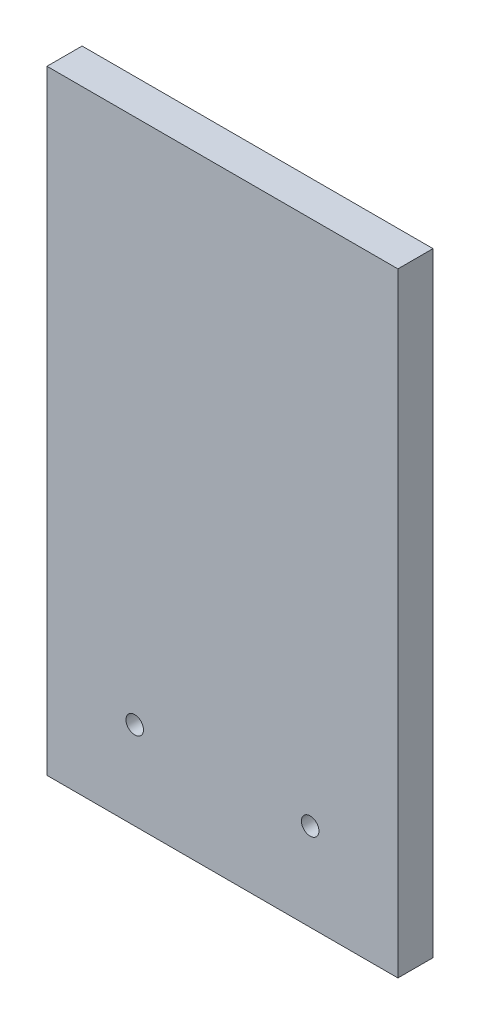
ISO-10303-21;
HEADER;
FILE_DESCRIPTION(('STEP AP214'),'2;1');
FILE_NAME('part.step','',(''),(''),'','','');
FILE_SCHEMA(('AUTOMOTIVE_DESIGN { 1 0 10303 214 1 1 1 1 }'));
ENDSEC;
DATA;
#1=APPLICATION_CONTEXT('core data for automotive mechanical design processes');
#2=APPLICATION_PROTOCOL_DEFINITION('international standard','automotive_design',2000,#1);
#3=PRODUCT_CONTEXT('',#1,'mechanical');
#4=PRODUCT('Part','Part','',(#3));
#5=PRODUCT_RELATED_PRODUCT_CATEGORY('part','',(#4));
#6=PRODUCT_DEFINITION_FORMATION('','',#4);
#7=PRODUCT_DEFINITION_CONTEXT('part definition',#1,'design');
#8=PRODUCT_DEFINITION('design','',#6,#7);
#9=PRODUCT_DEFINITION_SHAPE('','',#8);
#10=(LENGTH_UNIT() NAMED_UNIT(*) SI_UNIT(.MILLI.,.METRE.));
#11=(NAMED_UNIT(*) PLANE_ANGLE_UNIT() SI_UNIT($,.RADIAN.));
#12=(NAMED_UNIT(*) SI_UNIT($,.STERADIAN.) SOLID_ANGLE_UNIT());
#13=UNCERTAINTY_MEASURE_WITH_UNIT(LENGTH_MEASURE(1.E-05),#10,'distance_accuracy_value','');
#14=(GEOMETRIC_REPRESENTATION_CONTEXT(3) GLOBAL_UNCERTAINTY_ASSIGNED_CONTEXT((#13)) GLOBAL_UNIT_ASSIGNED_CONTEXT((#10,
#11,#12)) REPRESENTATION_CONTEXT('',''));
#15=CARTESIAN_POINT('',(0.,0.,0.));
#16=DIRECTION('',(0.,0.,1.));
#17=DIRECTION('',(1.,0.,0.));
#18=AXIS2_PLACEMENT_3D('',#15,#16,#17);
#19=CARTESIAN_POINT('',(50.,87.5,10.));
#20=DIRECTION('',(-1.,0.,0.));
#21=DIRECTION('',(0.,-1.,0.));
#22=AXIS2_PLACEMENT_3D('',#19,#20,#21);
#23=PLANE('',#22);
#24=DIRECTION('',(0.,1.,0.));
#25=VECTOR('',#24,1.);
#26=CARTESIAN_POINT('',(50.,87.5,0.));
#27=LINE('',#26,#25);
#28=CARTESIAN_POINT('',(50.,-87.5,0.));
#29=VERTEX_POINT('',#28);
#30=CARTESIAN_POINT('',(50.,87.5,0.));
#31=VERTEX_POINT('',#30);
#32=EDGE_CURVE('E111',#29,#31,#27,.T.);
#33=ORIENTED_EDGE('',*,*,#32,.T.);
#34=DIRECTION('',(0.,0.,-1.));
#35=VECTOR('',#34,1.);
#36=CARTESIAN_POINT('',(50.,87.5,10.));
#37=LINE('',#36,#35);
#38=CARTESIAN_POINT('',(50.,87.5,10.));
#39=VERTEX_POINT('',#38);
#40=EDGE_CURVE('E13',#39,#31,#37,.T.);
#41=ORIENTED_EDGE('',*,*,#40,.F.);
#42=DIRECTION('',(0.,1.,0.));
#43=VECTOR('',#42,1.);
#44=CARTESIAN_POINT('',(50.,87.5,10.));
#45=LINE('',#44,#43);
#46=CARTESIAN_POINT('',(50.,-87.5,10.));
#47=VERTEX_POINT('',#46);
#48=EDGE_CURVE('E99',#47,#39,#45,.T.);
#49=ORIENTED_EDGE('',*,*,#48,.F.);
#50=DIRECTION('',(0.,0.,-1.));
#51=VECTOR('',#50,1.);
#52=CARTESIAN_POINT('',(50.,-87.5,10.));
#53=LINE('',#52,#51);
#54=EDGE_CURVE('E107',#47,#29,#53,.T.);
#55=ORIENTED_EDGE('',*,*,#54,.T.);
#56=EDGE_LOOP('',(#33,#41,#49,#55));
#57=FACE_BOUND('',#56,.T.);
#58=ADVANCED_FACE('F48',(#57),#23,.F.);
#59=CARTESIAN_POINT('',(50.,87.5,10.));
#60=DIRECTION('',(0.,-1.,0.));
#61=DIRECTION('',(1.,0.,0.));
#62=AXIS2_PLACEMENT_3D('',#59,#60,#61);
#63=PLANE('',#62);
#64=DIRECTION('',(-1.,0.,0.));
#65=VECTOR('',#64,1.);
#66=CARTESIAN_POINT('',(50.,87.5,0.));
#67=LINE('',#66,#65);
#68=CARTESIAN_POINT('',(-50.,87.5,0.));
#69=VERTEX_POINT('',#68);
#70=EDGE_CURVE('E103',#31,#69,#67,.T.);
#71=ORIENTED_EDGE('',*,*,#70,.T.);
#72=DIRECTION('',(0.,0.,-1.));
#73=VECTOR('',#72,1.);
#74=CARTESIAN_POINT('',(-50.,87.5,10.));
#75=LINE('',#74,#73);
#76=CARTESIAN_POINT('',(-50.,87.5,10.));
#77=VERTEX_POINT('',#76);
#78=EDGE_CURVE('E56',#77,#69,#75,.T.);
#79=ORIENTED_EDGE('',*,*,#78,.F.);
#80=DIRECTION('',(-1.,0.,0.));
#81=VECTOR('',#80,1.);
#82=CARTESIAN_POINT('',(50.,87.5,10.));
#83=LINE('',#82,#81);
#84=EDGE_CURVE('E94',#39,#77,#83,.T.);
#85=ORIENTED_EDGE('',*,*,#84,.F.);
#86=ORIENTED_EDGE('',*,*,#40,.T.);
#87=EDGE_LOOP('',(#71,#79,#85,#86));
#88=FACE_BOUND('',#87,.T.);
#89=ADVANCED_FACE('F102',(#88),#63,.F.);
#90=CARTESIAN_POINT('',(-50.,87.5,10.));
#91=DIRECTION('',(1.,0.,0.));
#92=DIRECTION('',(0.,1.,0.));
#93=AXIS2_PLACEMENT_3D('',#90,#91,#92);
#94=PLANE('',#93);
#95=DIRECTION('',(0.,-1.,0.));
#96=VECTOR('',#95,1.);
#97=CARTESIAN_POINT('',(-50.,87.5,0.));
#98=LINE('',#97,#96);
#99=CARTESIAN_POINT('',(-50.,-87.5,0.));
#100=VERTEX_POINT('',#99);
#101=EDGE_CURVE('E81',#69,#100,#98,.T.);
#102=ORIENTED_EDGE('',*,*,#101,.T.);
#103=DIRECTION('',(0.,0.,-1.));
#104=VECTOR('',#103,1.);
#105=CARTESIAN_POINT('',(-50.,-87.5,10.));
#106=LINE('',#105,#104);
#107=CARTESIAN_POINT('',(-50.,-87.5,10.));
#108=VERTEX_POINT('',#107);
#109=EDGE_CURVE('E104',#108,#100,#106,.T.);
#110=ORIENTED_EDGE('',*,*,#109,.F.);
#111=DIRECTION('',(0.,-1.,0.));
#112=VECTOR('',#111,1.);
#113=CARTESIAN_POINT('',(-50.,87.5,10.));
#114=LINE('',#113,#112);
#115=EDGE_CURVE('E97',#77,#108,#114,.T.);
#116=ORIENTED_EDGE('',*,*,#115,.F.);
#117=ORIENTED_EDGE('',*,*,#78,.T.);
#118=EDGE_LOOP('',(#102,#110,#116,#117));
#119=FACE_BOUND('',#118,.T.);
#120=ADVANCED_FACE('F105',(#119),#94,.F.);
#121=CARTESIAN_POINT('',(50.,-87.5,10.));
#122=DIRECTION('',(0.,1.,0.));
#123=DIRECTION('',(-1.,0.,0.));
#124=AXIS2_PLACEMENT_3D('',#121,#122,#123);
#125=PLANE('',#124);
#126=DIRECTION('',(1.,0.,0.));
#127=VECTOR('',#126,1.);
#128=CARTESIAN_POINT('',(50.,-87.5,0.));
#129=LINE('',#128,#127);
#130=EDGE_CURVE('E87',#100,#29,#129,.T.);
#131=ORIENTED_EDGE('',*,*,#130,.T.);
#132=ORIENTED_EDGE('',*,*,#54,.F.);
#133=DIRECTION('',(1.,0.,0.));
#134=VECTOR('',#133,1.);
#135=CARTESIAN_POINT('',(50.,-87.5,10.));
#136=LINE('',#135,#134);
#137=EDGE_CURVE('E64',#108,#47,#136,.T.);
#138=ORIENTED_EDGE('',*,*,#137,.F.);
#139=ORIENTED_EDGE('',*,*,#109,.T.);
#140=EDGE_LOOP('',(#131,#132,#138,#139));
#141=FACE_BOUND('',#140,.T.);
#142=ADVANCED_FACE('F119',(#141),#125,.F.);
#143=CARTESIAN_POINT('',(0.,0.,10.));
#144=DIRECTION('',(0.,0.,-1.));
#145=DIRECTION('',(-1.,0.,0.));
#146=AXIS2_PLACEMENT_3D('',#143,#144,#145);
#147=PLANE('',#146);
#148=CARTESIAN_POINT('',(-25.,-62.5,10.));
#149=DIRECTION('',(0.,0.,1.));
#150=DIRECTION('',(1.,0.,0.));
#151=AXIS2_PLACEMENT_3D('',#148,#149,#150);
#152=CIRCLE('',#151,2.5);
#153=CARTESIAN_POINT('',(-22.5,-62.5,10.));
#154=VERTEX_POINT('',#153);
#155=EDGE_CURVE('E131',#154,#154,#152,.T.);
#156=ORIENTED_EDGE('',*,*,#155,.F.);
#157=EDGE_LOOP('',(#156));
#158=FACE_BOUND('',#157,.T.);
#159=CARTESIAN_POINT('',(25.,-62.5,10.));
#160=DIRECTION('',(0.,0.,1.));
#161=DIRECTION('',(1.,0.,0.));
#162=AXIS2_PLACEMENT_3D('',#159,#160,#161);
#163=CIRCLE('',#162,2.5);
#164=CARTESIAN_POINT('',(27.5,-62.5,10.));
#165=VERTEX_POINT('',#164);
#166=EDGE_CURVE('E128',#165,#165,#163,.T.);
#167=ORIENTED_EDGE('',*,*,#166,.F.);
#168=EDGE_LOOP('',(#167));
#169=FACE_BOUND('',#168,.T.);
#170=ORIENTED_EDGE('',*,*,#48,.T.);
#171=ORIENTED_EDGE('',*,*,#84,.T.);
#172=ORIENTED_EDGE('',*,*,#115,.T.);
#173=ORIENTED_EDGE('',*,*,#137,.T.);
#174=EDGE_LOOP('',(#170,#171,#172,#173));
#175=FACE_BOUND('',#174,.T.);
#176=ADVANCED_FACE('F95',(#158,#169,#175),#147,.F.);
#177=CARTESIAN_POINT('',(0.,0.,0.));
#178=DIRECTION('',(0.,0.,-1.));
#179=DIRECTION('',(-1.,0.,0.));
#180=AXIS2_PLACEMENT_3D('',#177,#178,#179);
#181=PLANE('',#180);
#182=CARTESIAN_POINT('',(-25.,-62.5,0.));
#183=DIRECTION('',(0.,0.,1.));
#184=DIRECTION('',(1.,0.,0.));
#185=AXIS2_PLACEMENT_3D('',#182,#183,#184);
#186=CIRCLE('',#185,2.5);
#187=CARTESIAN_POINT('',(-22.5,-62.5,0.));
#188=VERTEX_POINT('',#187);
#189=EDGE_CURVE('E114',#188,#188,#186,.T.);
#190=ORIENTED_EDGE('',*,*,#189,.T.);
#191=EDGE_LOOP('',(#190));
#192=FACE_BOUND('',#191,.T.);
#193=CARTESIAN_POINT('',(25.,-62.5,0.));
#194=DIRECTION('',(0.,0.,1.));
#195=DIRECTION('',(1.,0.,0.));
#196=AXIS2_PLACEMENT_3D('',#193,#194,#195);
#197=CIRCLE('',#196,2.5);
#198=CARTESIAN_POINT('',(27.5,-62.5,0.));
#199=VERTEX_POINT('',#198);
#200=EDGE_CURVE('E125',#199,#199,#197,.T.);
#201=ORIENTED_EDGE('',*,*,#200,.T.);
#202=EDGE_LOOP('',(#201));
#203=FACE_BOUND('',#202,.T.);
#204=ORIENTED_EDGE('',*,*,#32,.F.);
#205=ORIENTED_EDGE('',*,*,#130,.F.);
#206=ORIENTED_EDGE('',*,*,#101,.F.);
#207=ORIENTED_EDGE('',*,*,#70,.F.);
#208=EDGE_LOOP('',(#204,#205,#206,#207));
#209=FACE_BOUND('',#208,.T.);
#210=ADVANCED_FACE('F122',(#192,#203,#209),#181,.T.);
#211=CARTESIAN_POINT('',(25.,-62.5,0.));
#212=DIRECTION('',(0.,0.,1.));
#213=DIRECTION('',(1.,0.,0.));
#214=AXIS2_PLACEMENT_3D('',#211,#212,#213);
#215=CYLINDRICAL_SURFACE('',#214,2.5);
#216=ORIENTED_EDGE('',*,*,#200,.F.);
#217=EDGE_LOOP('',(#216));
#218=FACE_BOUND('',#217,.T.);
#219=ORIENTED_EDGE('',*,*,#166,.T.);
#220=EDGE_LOOP('',(#219));
#221=FACE_BOUND('',#220,.T.);
#222=ADVANCED_FACE('F142',(#218,#221),#215,.F.);
#223=CARTESIAN_POINT('',(-25.,-62.5,0.));
#224=DIRECTION('',(0.,0.,1.));
#225=DIRECTION('',(1.,0.,0.));
#226=AXIS2_PLACEMENT_3D('',#223,#224,#225);
#227=CYLINDRICAL_SURFACE('',#226,2.5);
#228=ORIENTED_EDGE('',*,*,#189,.F.);
#229=EDGE_LOOP('',(#228));
#230=FACE_BOUND('',#229,.T.);
#231=ORIENTED_EDGE('',*,*,#155,.T.);
#232=EDGE_LOOP('',(#231));
#233=FACE_BOUND('',#232,.T.);
#234=ADVANCED_FACE('F139',(#230,#233),#227,.F.);
#235=CLOSED_SHELL('',(#58,#89,#120,#142,#176,#210,#222,#234));
#236=MANIFOLD_SOLID_BREP('B2',#235);
#237=ADVANCED_BREP_SHAPE_REPRESENTATION('',(#18,#236),#14);
#238=SHAPE_DEFINITION_REPRESENTATION(#9,#237);
ENDSEC;
END-ISO-10303-21;
